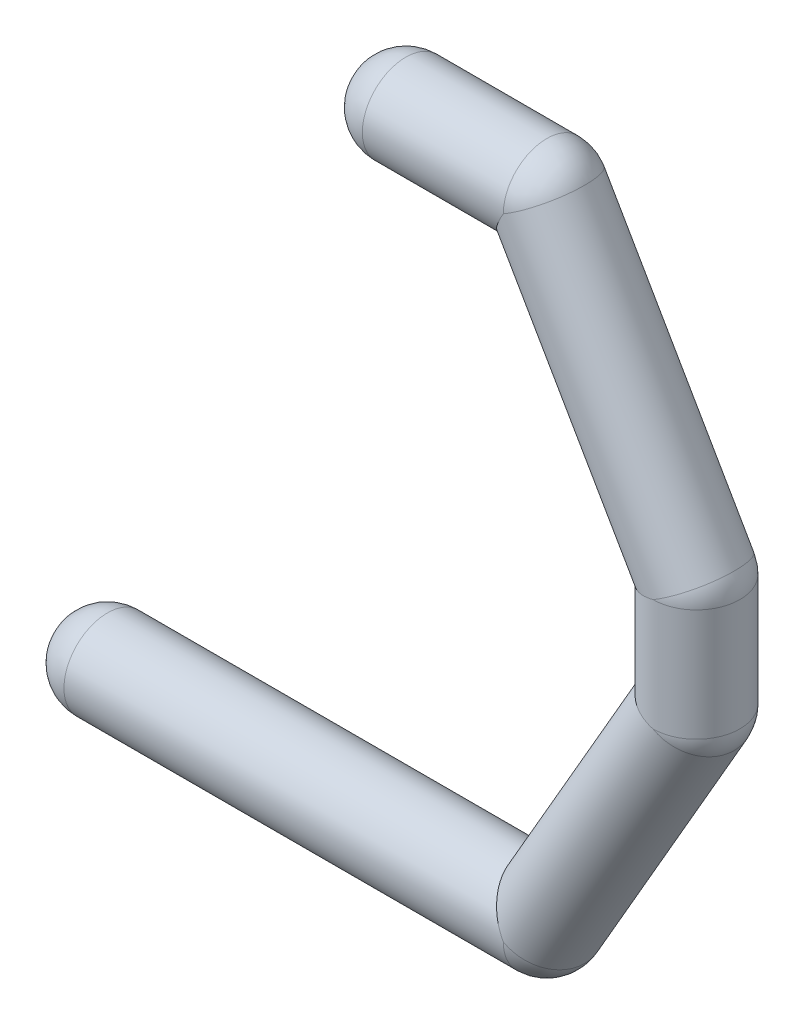
ISO-10303-21;
HEADER;
FILE_DESCRIPTION(('STEP AP214'),'2;1');
FILE_NAME('part.step','',(''),(''),'','','');
FILE_SCHEMA(('AUTOMOTIVE_DESIGN { 1 0 10303 214 1 1 1 1 }'));
ENDSEC;
DATA;
#1=APPLICATION_CONTEXT('core data for automotive mechanical design processes');
#2=APPLICATION_PROTOCOL_DEFINITION('international standard','automotive_design',2000,#1);
#3=PRODUCT_CONTEXT('',#1,'mechanical');
#4=PRODUCT('Part','Part','',(#3));
#5=PRODUCT_RELATED_PRODUCT_CATEGORY('part','',(#4));
#6=PRODUCT_DEFINITION_FORMATION('','',#4);
#7=PRODUCT_DEFINITION_CONTEXT('part definition',#1,'design');
#8=PRODUCT_DEFINITION('design','',#6,#7);
#9=PRODUCT_DEFINITION_SHAPE('','',#8);
#10=(LENGTH_UNIT() NAMED_UNIT(*) SI_UNIT(.MILLI.,.METRE.));
#11=(NAMED_UNIT(*) PLANE_ANGLE_UNIT() SI_UNIT($,.RADIAN.));
#12=(NAMED_UNIT(*) SI_UNIT($,.STERADIAN.) SOLID_ANGLE_UNIT());
#13=UNCERTAINTY_MEASURE_WITH_UNIT(LENGTH_MEASURE(1.E-05),#10,'distance_accuracy_value','');
#14=(GEOMETRIC_REPRESENTATION_CONTEXT(3) GLOBAL_UNCERTAINTY_ASSIGNED_CONTEXT((#13)) GLOBAL_UNIT_ASSIGNED_CONTEXT((#10,
#11,#12)) REPRESENTATION_CONTEXT('',''));
#15=CARTESIAN_POINT('',(0.,0.,0.));
#16=DIRECTION('',(0.,0.,1.));
#17=DIRECTION('',(1.,0.,0.));
#18=AXIS2_PLACEMENT_3D('',#15,#16,#17);
#19=CARTESIAN_POINT('',(20.388,-1.92,0.825));
#20=DIRECTION('',(1.,0.,0.));
#21=DIRECTION('',(0.,-1.,0.));
#22=AXIS2_PLACEMENT_3D('',#19,#20,#21);
#23=SPHERICAL_SURFACE('',#22,0.24);
#24=CARTESIAN_POINT('',(20.388,-1.92,0.825));
#25=DIRECTION('',(-1.,0.,0.));
#26=DIRECTION('',(0.,0.,1.));
#27=AXIS2_PLACEMENT_3D('',#24,#25,#26);
#28=CIRCLE('',#27,0.24);
#29=CARTESIAN_POINT('',(20.388,-1.92,1.065));
#30=VERTEX_POINT('',#29);
#31=EDGE_CURVE('E70',#30,#30,#28,.F.);
#32=ORIENTED_EDGE('',*,*,#31,.F.);
#33=EDGE_LOOP('',(#32));
#34=FACE_BOUND('',#33,.T.);
#35=ADVANCED_FACE('F63',(#34),#23,.T.);
#36=CARTESIAN_POINT('',(21.166,-1.92,0.825));
#37=DIRECTION('',(-1.,0.,0.));
#38=DIRECTION('',(0.,0.,1.));
#39=AXIS2_PLACEMENT_3D('',#36,#37,#38);
#40=CYLINDRICAL_SURFACE('',#39,0.24);
#41=CARTESIAN_POINT('',(21.166,-1.92,0.825));
#42=DIRECTION('',(-0.866000737383216,0.50004272102664,0.));
#43=DIRECTION('',(-0.500042721026639,-0.866000737383216,0.));
#44=AXIS2_PLACEMENT_3D('',#41,#42,#43);
#45=ELLIPSE('',#44,0.277136022684236,0.24);
#46=CARTESIAN_POINT('',(21.166,-1.92,1.065));
#47=VERTEX_POINT('',#46);
#48=CARTESIAN_POINT('',(21.166,-1.92,0.585));
#49=VERTEX_POINT('',#48);
#50=EDGE_CURVE('E12',#47,#49,#45,.F.);
#51=ORIENTED_EDGE('',*,*,#50,.F.);
#52=CARTESIAN_POINT('',(21.166,-1.92,0.825));
#53=DIRECTION('',(-1.,0.,0.));
#54=DIRECTION('',(0.,0.,1.));
#55=AXIS2_PLACEMENT_3D('',#52,#53,#54);
#56=CIRCLE('',#55,0.24);
#57=EDGE_CURVE('E77',#47,#49,#56,.T.);
#58=ORIENTED_EDGE('',*,*,#57,.T.);
#59=EDGE_LOOP('',(#51,#58));
#60=FACE_BOUND('',#59,.T.);
#61=ORIENTED_EDGE('',*,*,#31,.T.);
#62=EDGE_LOOP('',(#61));
#63=FACE_BOUND('',#62,.T.);
#64=ADVANCED_FACE('F137',(#60,#63),#40,.T.);
#65=CARTESIAN_POINT('',(21.166,-1.92,0.825));
#66=DIRECTION('',(1.,0.,0.));
#67=DIRECTION('',(0.,-1.,0.));
#68=AXIS2_PLACEMENT_3D('',#65,#66,#67);
#69=SPHERICAL_SURFACE('',#68,0.24);
#70=ORIENTED_EDGE('',*,*,#57,.F.);
#71=CARTESIAN_POINT('',(21.166,-1.92,0.825));
#72=DIRECTION('',(-0.499914554296549,0.86607473026436,0.));
#73=DIRECTION('',(-0.86607473026436,-0.499914554296549,0.));
#74=AXIS2_PLACEMENT_3D('',#71,#72,#73);
#75=CIRCLE('',#74,0.24);
#76=EDGE_CURVE('E128',#49,#47,#75,.F.);
#77=ORIENTED_EDGE('',*,*,#76,.F.);
#78=EDGE_LOOP('',(#70,#77));
#79=FACE_BOUND('',#78,.T.);
#80=ADVANCED_FACE('F143',(#79),#69,.T.);
#81=CARTESIAN_POINT('',(21.992,-3.35100000000001,0.825));
#82=DIRECTION('',(-0.499914554296549,0.86607473026436,0.));
#83=DIRECTION('',(-0.86607473026436,-0.499914554296549,0.));
#84=AXIS2_PLACEMENT_3D('',#81,#82,#83);
#85=CYLINDRICAL_SURFACE('',#84,0.24);
#86=CARTESIAN_POINT('',(21.992,-3.35100000000001,0.825));
#87=DIRECTION('',(-0.258771394995313,0.965938592837132,0.));
#88=DIRECTION('',(-0.965938592837132,-0.258771394995313,0.));
#89=AXIS2_PLACEMENT_3D('',#86,#87,#88);
#90=ELLIPSE('',#89,0.248462999387029,0.24);
#91=CARTESIAN_POINT('',(21.992,-3.35100000000001,1.065));
#92=VERTEX_POINT('',#91);
#93=CARTESIAN_POINT('',(21.992,-3.351,0.585));
#94=VERTEX_POINT('',#93);
#95=EDGE_CURVE('E131',#92,#94,#90,.F.);
#96=ORIENTED_EDGE('',*,*,#95,.F.);
#97=CARTESIAN_POINT('',(21.992,-3.35100000000001,0.825));
#98=DIRECTION('',(-0.499914554296552,0.866074730264358,0.));
#99=DIRECTION('',(-0.866074730264358,-0.499914554296552,0.));
#100=AXIS2_PLACEMENT_3D('',#97,#98,#99);
#101=CIRCLE('',#100,0.24);
#102=EDGE_CURVE('E126',#92,#94,#101,.T.);
#103=ORIENTED_EDGE('',*,*,#102,.T.);
#104=EDGE_LOOP('',(#96,#103));
#105=FACE_BOUND('',#104,.T.);
#106=ORIENTED_EDGE('',*,*,#76,.T.);
#107=ORIENTED_EDGE('',*,*,#50,.T.);
#108=EDGE_LOOP('',(#106,#107));
#109=FACE_BOUND('',#108,.T.);
#110=ADVANCED_FACE('F147',(#105,#109),#85,.T.);
#111=CARTESIAN_POINT('',(21.992,-3.351,0.825));
#112=DIRECTION('',(1.,0.,0.));
#113=DIRECTION('',(0.,-1.,0.));
#114=AXIS2_PLACEMENT_3D('',#111,#112,#113);
#115=SPHERICAL_SURFACE('',#114,0.24);
#116=ORIENTED_EDGE('',*,*,#102,.F.);
#117=CARTESIAN_POINT('',(21.992,-3.351,0.825));
#118=DIRECTION('',(0.,1.,0.));
#119=DIRECTION('',(0.,0.,1.));
#120=AXIS2_PLACEMENT_3D('',#117,#118,#119);
#121=CIRCLE('',#120,0.24);
#122=EDGE_CURVE('E116',#94,#92,#121,.F.);
#123=ORIENTED_EDGE('',*,*,#122,.F.);
#124=EDGE_LOOP('',(#116,#123));
#125=FACE_BOUND('',#124,.T.);
#126=ADVANCED_FACE('F153',(#125),#115,.T.);
#127=CARTESIAN_POINT('',(21.992,-3.969,0.825));
#128=DIRECTION('',(0.,1.,0.));
#129=DIRECTION('',(0.,0.,1.));
#130=AXIS2_PLACEMENT_3D('',#127,#128,#129);
#131=CYLINDRICAL_SURFACE('',#130,0.240000000000001);
#132=CARTESIAN_POINT('',(21.992,-3.96899999999999,0.825));
#133=DIRECTION('',(0.258771394995313,0.965938592837133,0.));
#134=DIRECTION('',(-0.965938592837133,0.258771394995313,0.));
#135=AXIS2_PLACEMENT_3D('',#132,#133,#134);
#136=ELLIPSE('',#135,0.248462999387029,0.24);
#137=CARTESIAN_POINT('',(21.992,-3.969,1.065));
#138=VERTEX_POINT('',#137);
#139=CARTESIAN_POINT('',(21.992,-3.969,0.585));
#140=VERTEX_POINT('',#139);
#141=EDGE_CURVE('E123',#138,#140,#136,.F.);
#142=ORIENTED_EDGE('',*,*,#141,.F.);
#143=CARTESIAN_POINT('',(21.992,-3.969,0.825));
#144=DIRECTION('',(0.,1.,0.));
#145=DIRECTION('',(0.,0.,1.));
#146=AXIS2_PLACEMENT_3D('',#143,#144,#145);
#147=CIRCLE('',#146,0.240000000000001);
#148=EDGE_CURVE('E114',#138,#140,#147,.T.);
#149=ORIENTED_EDGE('',*,*,#148,.T.);
#150=EDGE_LOOP('',(#142,#149));
#151=FACE_BOUND('',#150,.T.);
#152=ORIENTED_EDGE('',*,*,#122,.T.);
#153=ORIENTED_EDGE('',*,*,#95,.T.);
#154=EDGE_LOOP('',(#152,#153));
#155=FACE_BOUND('',#154,.T.);
#156=ADVANCED_FACE('F157',(#151,#155),#131,.T.);
#157=CARTESIAN_POINT('',(21.992,-3.969,0.825));
#158=DIRECTION('',(1.,0.,0.));
#159=DIRECTION('',(0.,-1.,0.));
#160=AXIS2_PLACEMENT_3D('',#157,#158,#159);
#161=SPHERICAL_SURFACE('',#160,0.24);
#162=ORIENTED_EDGE('',*,*,#148,.F.);
#163=CARTESIAN_POINT('',(21.992,-3.969,0.825));
#164=DIRECTION('',(0.499914554296549,0.86607473026436,0.));
#165=DIRECTION('',(-0.86607473026436,0.499914554296549,0.));
#166=AXIS2_PLACEMENT_3D('',#163,#164,#165);
#167=CIRCLE('',#166,0.24);
#168=EDGE_CURVE('E104',#140,#138,#167,.F.);
#169=ORIENTED_EDGE('',*,*,#168,.F.);
#170=EDGE_LOOP('',(#162,#169));
#171=FACE_BOUND('',#170,.T.);
#172=ADVANCED_FACE('F161',(#171),#161,.T.);
#173=CARTESIAN_POINT('',(21.166,-5.4,0.825));
#174=DIRECTION('',(0.499914554296549,0.86607473026436,0.));
#175=DIRECTION('',(-0.86607473026436,0.499914554296549,0.));
#176=AXIS2_PLACEMENT_3D('',#173,#174,#175);
#177=CYLINDRICAL_SURFACE('',#176,0.24);
#178=CARTESIAN_POINT('',(21.166,-5.4,0.825));
#179=DIRECTION('',(0.866000737383216,0.500042721026639,0.));
#180=DIRECTION('',(-0.50004272102664,0.866000737383216,0.));
#181=AXIS2_PLACEMENT_3D('',#178,#179,#180);
#182=ELLIPSE('',#181,0.277136022684236,0.24);
#183=CARTESIAN_POINT('',(21.166,-5.4,1.065));
#184=VERTEX_POINT('',#183);
#185=CARTESIAN_POINT('',(21.166,-5.4,0.585));
#186=VERTEX_POINT('',#185);
#187=EDGE_CURVE('E109',#184,#186,#182,.F.);
#188=ORIENTED_EDGE('',*,*,#187,.F.);
#189=CARTESIAN_POINT('',(21.166,-5.4,0.825));
#190=DIRECTION('',(0.499914554296552,0.866074730264358,0.));
#191=DIRECTION('',(-0.866074730264358,0.499914554296552,0.));
#192=AXIS2_PLACEMENT_3D('',#189,#190,#191);
#193=CIRCLE('',#192,0.24);
#194=EDGE_CURVE('E97',#184,#186,#193,.T.);
#195=ORIENTED_EDGE('',*,*,#194,.T.);
#196=EDGE_LOOP('',(#188,#195));
#197=FACE_BOUND('',#196,.T.);
#198=ORIENTED_EDGE('',*,*,#168,.T.);
#199=ORIENTED_EDGE('',*,*,#141,.T.);
#200=EDGE_LOOP('',(#198,#199));
#201=FACE_BOUND('',#200,.T.);
#202=ADVANCED_FACE('F112',(#197,#201),#177,.T.);
#203=CARTESIAN_POINT('',(21.166,-5.4,0.825));
#204=DIRECTION('',(1.,0.,0.));
#205=DIRECTION('',(0.,-1.,0.));
#206=AXIS2_PLACEMENT_3D('',#203,#204,#205);
#207=SPHERICAL_SURFACE('',#206,0.24);
#208=ORIENTED_EDGE('',*,*,#194,.F.);
#209=CARTESIAN_POINT('',(21.166,-5.4,0.825));
#210=DIRECTION('',(1.,0.,0.));
#211=DIRECTION('',(0.,0.,-1.));
#212=AXIS2_PLACEMENT_3D('',#209,#210,#211);
#213=CIRCLE('',#212,0.24);
#214=EDGE_CURVE('E100',#184,#186,#213,.T.);
#215=ORIENTED_EDGE('',*,*,#214,.T.);
#216=EDGE_LOOP('',(#208,#215));
#217=FACE_BOUND('',#216,.T.);
#218=ADVANCED_FACE('F99',(#217),#207,.T.);
#219=CARTESIAN_POINT('',(18.741,-5.4,0.825));
#220=DIRECTION('',(1.,0.,0.));
#221=DIRECTION('',(0.,0.,-1.));
#222=AXIS2_PLACEMENT_3D('',#219,#220,#221);
#223=CYLINDRICAL_SURFACE('',#222,0.24);
#224=ORIENTED_EDGE('',*,*,#214,.F.);
#225=ORIENTED_EDGE('',*,*,#187,.T.);
#226=EDGE_LOOP('',(#224,#225));
#227=FACE_BOUND('',#226,.T.);
#228=CARTESIAN_POINT('',(18.741,-5.4,0.825));
#229=DIRECTION('',(1.,0.,0.));
#230=DIRECTION('',(0.,0.,-1.));
#231=AXIS2_PLACEMENT_3D('',#228,#229,#230);
#232=CIRCLE('',#231,0.24);
#233=CARTESIAN_POINT('',(18.741,-5.4,0.585));
#234=VERTEX_POINT('',#233);
#235=EDGE_CURVE('E110',#234,#234,#232,.T.);
#236=ORIENTED_EDGE('',*,*,#235,.T.);
#237=EDGE_LOOP('',(#236));
#238=FACE_BOUND('',#237,.T.);
#239=ADVANCED_FACE('F107',(#227,#238),#223,.T.);
#240=CARTESIAN_POINT('',(18.741,-5.4,0.825));
#241=DIRECTION('',(1.,0.,0.));
#242=DIRECTION('',(0.,-1.,0.));
#243=AXIS2_PLACEMENT_3D('',#240,#241,#242);
#244=SPHERICAL_SURFACE('',#243,0.24);
#245=ORIENTED_EDGE('',*,*,#235,.F.);
#246=EDGE_LOOP('',(#245));
#247=FACE_BOUND('',#246,.T.);
#248=ADVANCED_FACE('F168',(#247),#244,.T.);
#249=CLOSED_SHELL('',(#35,#64,#80,#110,#126,#156,#172,#202,#218,#239,#248));
#250=MANIFOLD_SOLID_BREP('B2',#249);
#251=ADVANCED_BREP_SHAPE_REPRESENTATION('',(#18,#250),#14);
#252=SHAPE_DEFINITION_REPRESENTATION(#9,#251);
ENDSEC;
END-ISO-10303-21;
